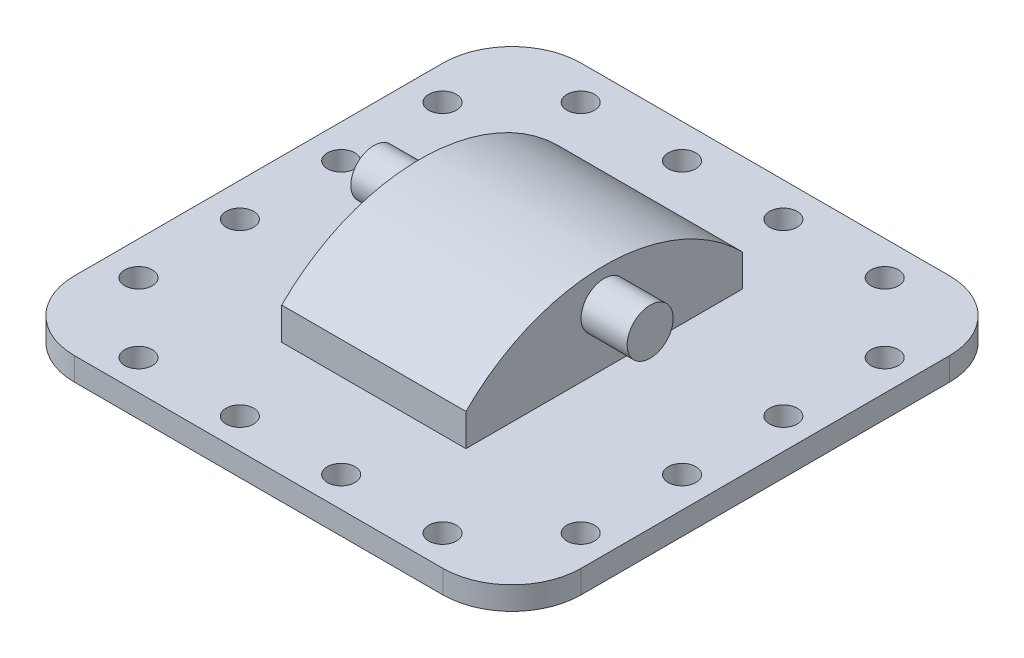
ISO-10303-21;
HEADER;
FILE_DESCRIPTION(('STEP AP214'),'2;1');
FILE_NAME('part.step','',(''),(''),'','','');
FILE_SCHEMA(('AUTOMOTIVE_DESIGN { 1 0 10303 214 1 1 1 1 }'));
ENDSEC;
DATA;
#1=APPLICATION_CONTEXT('core data for automotive mechanical design processes');
#2=APPLICATION_PROTOCOL_DEFINITION('international standard','automotive_design',2000,#1);
#3=PRODUCT_CONTEXT('',#1,'mechanical');
#4=PRODUCT('Part','Part','',(#3));
#5=PRODUCT_RELATED_PRODUCT_CATEGORY('part','',(#4));
#6=PRODUCT_DEFINITION_FORMATION('','',#4);
#7=PRODUCT_DEFINITION_CONTEXT('part definition',#1,'design');
#8=PRODUCT_DEFINITION('design','',#6,#7);
#9=PRODUCT_DEFINITION_SHAPE('','',#8);
#10=(LENGTH_UNIT() NAMED_UNIT(*) SI_UNIT(.MILLI.,.METRE.));
#11=(NAMED_UNIT(*) PLANE_ANGLE_UNIT() SI_UNIT($,.RADIAN.));
#12=(NAMED_UNIT(*) SI_UNIT($,.STERADIAN.) SOLID_ANGLE_UNIT());
#13=UNCERTAINTY_MEASURE_WITH_UNIT(LENGTH_MEASURE(1.E-05),#10,'distance_accuracy_value','');
#14=(GEOMETRIC_REPRESENTATION_CONTEXT(3) GLOBAL_UNCERTAINTY_ASSIGNED_CONTEXT((#13)) GLOBAL_UNIT_ASSIGNED_CONTEXT((#10,
#11,#12)) REPRESENTATION_CONTEXT('',''));
#15=CARTESIAN_POINT('',(0.,0.,0.));
#16=DIRECTION('',(0.,0.,1.));
#17=DIRECTION('',(1.,0.,0.));
#18=AXIS2_PLACEMENT_3D('',#15,#16,#17);
#19=CARTESIAN_POINT('',(40.,5.,55.));
#20=DIRECTION('',(0.,1.,0.));
#21=DIRECTION('',(0.,0.,1.));
#22=AXIS2_PLACEMENT_3D('',#19,#20,#21);
#23=PLANE('',#22);
#24=CARTESIAN_POINT('',(48.3346963055934,5.,-10.5816296180082));
#25=DIRECTION('',(0.,-1.,0.));
#26=DIRECTION('',(0.,0.,-1.));
#27=AXIS2_PLACEMENT_3D('',#24,#25,#26);
#28=CIRCLE('',#27,3.00000000000002);
#29=CARTESIAN_POINT('',(48.3346963055934,5.,-13.5816296180082));
#30=VERTEX_POINT('',#29);
#31=EDGE_CURVE('E151',#30,#30,#28,.T.);
#32=ORIENTED_EDGE('',*,*,#31,.T.);
#33=EDGE_LOOP('',(#32));
#34=FACE_BOUND('',#33,.T.);
#35=CARTESIAN_POINT('',(-32.6653036944065,5.,-47.5816296180083));
#36=DIRECTION('',(0.,-1.,0.));
#37=DIRECTION('',(0.,0.,-1.));
#38=AXIS2_PLACEMENT_3D('',#35,#36,#37);
#39=CIRCLE('',#38,3.00000000000001);
#40=CARTESIAN_POINT('',(-32.6653036944065,5.,-50.5816296180083));
#41=VERTEX_POINT('',#40);
#42=EDGE_CURVE('E155',#41,#41,#39,.T.);
#43=ORIENTED_EDGE('',*,*,#42,.T.);
#44=EDGE_LOOP('',(#43));
#45=FACE_BOUND('',#44,.T.);
#46=CARTESIAN_POINT('',(-47.6653036944066,5.,-32.5816296180082));
#47=DIRECTION('',(0.,-1.,0.));
#48=DIRECTION('',(0.,0.,-1.));
#49=AXIS2_PLACEMENT_3D('',#46,#47,#48);
#50=CIRCLE('',#49,3.);
#51=CARTESIAN_POINT('',(-47.6653036944066,5.,-35.5816296180082));
#52=VERTEX_POINT('',#51);
#53=EDGE_CURVE('E159',#52,#52,#50,.T.);
#54=ORIENTED_EDGE('',*,*,#53,.T.);
#55=EDGE_LOOP('',(#54));
#56=FACE_BOUND('',#55,.T.);
#57=CARTESIAN_POINT('',(-47.6653036944066,5.,-10.5816296180082));
#58=DIRECTION('',(0.,-1.,0.));
#59=DIRECTION('',(0.,0.,-1.));
#60=AXIS2_PLACEMENT_3D('',#57,#58,#59);
#61=CIRCLE('',#60,3.00000000000003);
#62=CARTESIAN_POINT('',(-47.6653036944066,5.,-13.5816296180083));
#63=VERTEX_POINT('',#62);
#64=EDGE_CURVE('E163',#63,#63,#61,.T.);
#65=ORIENTED_EDGE('',*,*,#64,.T.);
#66=EDGE_LOOP('',(#65));
#67=FACE_BOUND('',#66,.T.);
#68=CARTESIAN_POINT('',(-47.6653036944066,5.,11.4183703819918));
#69=DIRECTION('',(0.,-1.,0.));
#70=DIRECTION('',(0.,0.,-1.));
#71=AXIS2_PLACEMENT_3D('',#68,#69,#70);
#72=CIRCLE('',#71,2.99999999999997);
#73=CARTESIAN_POINT('',(-47.6653036944066,5.,8.4183703819918));
#74=VERTEX_POINT('',#73);
#75=EDGE_CURVE('E167',#74,#74,#72,.T.);
#76=ORIENTED_EDGE('',*,*,#75,.T.);
#77=EDGE_LOOP('',(#76));
#78=FACE_BOUND('',#77,.T.);
#79=CARTESIAN_POINT('',(-10.6653036944066,5.,48.4183703819918));
#80=DIRECTION('',(0.,-1.,0.));
#81=DIRECTION('',(0.,0.,-1.));
#82=AXIS2_PLACEMENT_3D('',#79,#80,#81);
#83=CIRCLE('',#82,3.00000000000002);
#84=CARTESIAN_POINT('',(-10.6653036944066,5.,45.4183703819917));
#85=VERTEX_POINT('',#84);
#86=EDGE_CURVE('E171',#85,#85,#83,.T.);
#87=ORIENTED_EDGE('',*,*,#86,.T.);
#88=EDGE_LOOP('',(#87));
#89=FACE_BOUND('',#88,.T.);
#90=CARTESIAN_POINT('',(11.3346963055934,5.,48.4183703819918));
#91=DIRECTION('',(0.,-1.,0.));
#92=DIRECTION('',(0.,0.,-1.));
#93=AXIS2_PLACEMENT_3D('',#90,#91,#92);
#94=CIRCLE('',#93,2.99999999999997);
#95=CARTESIAN_POINT('',(11.3346963055934,5.,45.4183703819918));
#96=VERTEX_POINT('',#95);
#97=EDGE_CURVE('E175',#96,#96,#94,.T.);
#98=ORIENTED_EDGE('',*,*,#97,.T.);
#99=EDGE_LOOP('',(#98));
#100=FACE_BOUND('',#99,.T.);
#101=CARTESIAN_POINT('',(33.3346963055934,5.,48.4183703819918));
#102=DIRECTION('',(0.,-1.,0.));
#103=DIRECTION('',(0.,0.,-1.));
#104=AXIS2_PLACEMENT_3D('',#101,#102,#103);
#105=CIRCLE('',#104,3.00000000000001);
#106=CARTESIAN_POINT('',(33.3346963055934,5.,45.4183703819917));
#107=VERTEX_POINT('',#106);
#108=EDGE_CURVE('E179',#107,#107,#105,.T.);
#109=ORIENTED_EDGE('',*,*,#108,.T.);
#110=EDGE_LOOP('',(#109));
#111=FACE_BOUND('',#110,.T.);
#112=CARTESIAN_POINT('',(48.3346963055934,5.,11.4183703819918));
#113=DIRECTION('',(0.,-1.,0.));
#114=DIRECTION('',(0.,0.,-1.));
#115=AXIS2_PLACEMENT_3D('',#112,#113,#114);
#116=CIRCLE('',#115,2.99999999999997);
#117=CARTESIAN_POINT('',(48.3346963055934,5.,8.4183703819918));
#118=VERTEX_POINT('',#117);
#119=EDGE_CURVE('E183',#118,#118,#116,.T.);
#120=ORIENTED_EDGE('',*,*,#119,.T.);
#121=EDGE_LOOP('',(#120));
#122=FACE_BOUND('',#121,.T.);
#123=CARTESIAN_POINT('',(48.3346963055935,5.,-32.5816296180082));
#124=DIRECTION('',(0.,-1.,0.));
#125=DIRECTION('',(0.,0.,-1.));
#126=AXIS2_PLACEMENT_3D('',#123,#124,#125);
#127=CIRCLE('',#126,3.00000000000001);
#128=CARTESIAN_POINT('',(48.3346963055935,5.,-35.5816296180082));
#129=VERTEX_POINT('',#128);
#130=EDGE_CURVE('E187',#129,#129,#127,.T.);
#131=ORIENTED_EDGE('',*,*,#130,.T.);
#132=EDGE_LOOP('',(#131));
#133=FACE_BOUND('',#132,.T.);
#134=CARTESIAN_POINT('',(33.3346963055935,5.,-47.5816296180082));
#135=DIRECTION('',(0.,-1.,0.));
#136=DIRECTION('',(0.,0.,-1.));
#137=AXIS2_PLACEMENT_3D('',#134,#135,#136);
#138=CIRCLE('',#137,2.99999999999997);
#139=CARTESIAN_POINT('',(33.3346963055935,5.,-50.5816296180082));
#140=VERTEX_POINT('',#139);
#141=EDGE_CURVE('E191',#140,#140,#138,.T.);
#142=ORIENTED_EDGE('',*,*,#141,.T.);
#143=EDGE_LOOP('',(#142));
#144=FACE_BOUND('',#143,.T.);
#145=CARTESIAN_POINT('',(11.3346963055935,5.,-47.5816296180082));
#146=DIRECTION('',(0.,-1.,0.));
#147=DIRECTION('',(0.,0.,-1.));
#148=AXIS2_PLACEMENT_3D('',#145,#146,#147);
#149=CIRCLE('',#148,2.99999999999997);
#150=CARTESIAN_POINT('',(11.3346963055935,5.,-50.5816296180082));
#151=VERTEX_POINT('',#150);
#152=EDGE_CURVE('E195',#151,#151,#149,.T.);
#153=ORIENTED_EDGE('',*,*,#152,.T.);
#154=EDGE_LOOP('',(#153));
#155=FACE_BOUND('',#154,.T.);
#156=CARTESIAN_POINT('',(-10.6653036944065,5.,-47.5816296180082));
#157=DIRECTION('',(0.,-1.,0.));
#158=DIRECTION('',(0.,0.,-1.));
#159=AXIS2_PLACEMENT_3D('',#156,#157,#158);
#160=CIRCLE('',#159,3.00000000000002);
#161=CARTESIAN_POINT('',(-10.6653036944065,5.,-50.5816296180083));
#162=VERTEX_POINT('',#161);
#163=EDGE_CURVE('E199',#162,#162,#160,.T.);
#164=ORIENTED_EDGE('',*,*,#163,.T.);
#165=EDGE_LOOP('',(#164));
#166=FACE_BOUND('',#165,.T.);
#167=CARTESIAN_POINT('',(-47.6653036944065,5.,33.4183703819918));
#168=DIRECTION('',(0.,-1.,0.));
#169=DIRECTION('',(0.,0.,-1.));
#170=AXIS2_PLACEMENT_3D('',#167,#168,#169);
#171=CIRCLE('',#170,3.);
#172=CARTESIAN_POINT('',(-47.6653036944065,5.,30.4183703819918));
#173=VERTEX_POINT('',#172);
#174=EDGE_CURVE('E203',#173,#173,#171,.T.);
#175=ORIENTED_EDGE('',*,*,#174,.T.);
#176=EDGE_LOOP('',(#175));
#177=FACE_BOUND('',#176,.T.);
#178=CARTESIAN_POINT('',(-32.6653036944065,5.,48.4183703819918));
#179=DIRECTION('',(0.,-1.,0.));
#180=DIRECTION('',(0.,0.,-1.));
#181=AXIS2_PLACEMENT_3D('',#178,#179,#180);
#182=CIRCLE('',#181,3.00000000000001);
#183=CARTESIAN_POINT('',(-32.6653036944065,5.,45.4183703819918));
#184=VERTEX_POINT('',#183);
#185=EDGE_CURVE('E207',#184,#184,#182,.T.);
#186=ORIENTED_EDGE('',*,*,#185,.T.);
#187=EDGE_LOOP('',(#186));
#188=FACE_BOUND('',#187,.T.);
#189=CARTESIAN_POINT('',(48.3346963055934,5.,33.4183703819918));
#190=DIRECTION('',(0.,-1.,0.));
#191=DIRECTION('',(0.,0.,-1.));
#192=AXIS2_PLACEMENT_3D('',#189,#190,#191);
#193=CIRCLE('',#192,3.00000000000001);
#194=CARTESIAN_POINT('',(48.3346963055934,5.,30.4183703819918));
#195=VERTEX_POINT('',#194);
#196=EDGE_CURVE('E211',#195,#195,#193,.T.);
#197=ORIENTED_EDGE('',*,*,#196,.T.);
#198=EDGE_LOOP('',(#197));
#199=FACE_BOUND('',#198,.T.);
#200=DIRECTION('',(1.,0.,0.));
#201=VECTOR('',#200,1.);
#202=CARTESIAN_POINT('',(-55.,5.,55.));
#203=LINE('',#202,#201);
#204=CARTESIAN_POINT('',(-40.,5.,55.));
#205=VERTEX_POINT('',#204);
#206=CARTESIAN_POINT('',(40.,5.,55.));
#207=VERTEX_POINT('',#206);
#208=EDGE_CURVE('E122',#205,#207,#203,.T.);
#209=ORIENTED_EDGE('',*,*,#208,.T.);
#210=CARTESIAN_POINT('',(40.,5.,40.));
#211=DIRECTION('',(0.,-1.,0.));
#212=DIRECTION('',(0.,0.,-1.));
#213=AXIS2_PLACEMENT_3D('',#210,#211,#212);
#214=CIRCLE('',#213,15.);
#215=CARTESIAN_POINT('',(55.,5.,40.));
#216=VERTEX_POINT('',#215);
#217=EDGE_CURVE('E119',#207,#216,#214,.F.);
#218=ORIENTED_EDGE('',*,*,#217,.T.);
#219=DIRECTION('',(0.,0.,-1.));
#220=VECTOR('',#219,1.);
#221=CARTESIAN_POINT('',(55.,5.,55.));
#222=LINE('',#221,#220);
#223=CARTESIAN_POINT('',(55.,5.,-40.));
#224=VERTEX_POINT('',#223);
#225=EDGE_CURVE('E77',#216,#224,#222,.T.);
#226=ORIENTED_EDGE('',*,*,#225,.T.);
#227=CARTESIAN_POINT('',(40.,5.,-40.));
#228=DIRECTION('',(0.,-1.,0.));
#229=DIRECTION('',(0.,0.,-1.));
#230=AXIS2_PLACEMENT_3D('',#227,#228,#229);
#231=CIRCLE('',#230,15.);
#232=CARTESIAN_POINT('',(40.,5.,-55.));
#233=VERTEX_POINT('',#232);
#234=EDGE_CURVE('E345',#224,#233,#231,.F.);
#235=ORIENTED_EDGE('',*,*,#234,.T.);
#236=DIRECTION('',(-1.,0.,0.));
#237=VECTOR('',#236,1.);
#238=CARTESIAN_POINT('',(-55.,5.,-55.));
#239=LINE('',#238,#237);
#240=CARTESIAN_POINT('',(-40.,5.,-55.));
#241=VERTEX_POINT('',#240);
#242=EDGE_CURVE('E139',#233,#241,#239,.T.);
#243=ORIENTED_EDGE('',*,*,#242,.T.);
#244=CARTESIAN_POINT('',(-40.,5.,-40.));
#245=DIRECTION('',(0.,-1.,0.));
#246=DIRECTION('',(0.,0.,-1.));
#247=AXIS2_PLACEMENT_3D('',#244,#245,#246);
#248=CIRCLE('',#247,15.);
#249=CARTESIAN_POINT('',(-55.,5.,-40.));
#250=VERTEX_POINT('',#249);
#251=EDGE_CURVE('E313',#241,#250,#248,.F.);
#252=ORIENTED_EDGE('',*,*,#251,.T.);
#253=DIRECTION('',(0.,0.,1.));
#254=VECTOR('',#253,1.);
#255=CARTESIAN_POINT('',(-55.,5.,55.));
#256=LINE('',#255,#254);
#257=CARTESIAN_POINT('',(-55.,5.,40.));
#258=VERTEX_POINT('',#257);
#259=EDGE_CURVE('E147',#250,#258,#256,.T.);
#260=ORIENTED_EDGE('',*,*,#259,.T.);
#261=CARTESIAN_POINT('',(-40.,5.,40.));
#262=DIRECTION('',(0.,-1.,0.));
#263=DIRECTION('',(0.,0.,-1.));
#264=AXIS2_PLACEMENT_3D('',#261,#262,#263);
#265=CIRCLE('',#264,15.);
#266=EDGE_CURVE('E311',#258,#205,#265,.F.);
#267=ORIENTED_EDGE('',*,*,#266,.T.);
#268=EDGE_LOOP('',(#209,#218,#226,#235,#243,#252,#260,#267));
#269=FACE_BOUND('',#268,.T.);
#270=ADVANCED_FACE('F52',(#34,#45,#56,#67,#78,#89,#100,#111,#122,#133,#144,#155,#166,#177,#188,
#199,#269),#23,.T.);
#271=CARTESIAN_POINT('',(40.,5.,-40.));
#272=DIRECTION('',(0.,1.,0.));
#273=DIRECTION('',(0.,0.,1.));
#274=AXIS2_PLACEMENT_3D('',#271,#272,#273);
#275=CYLINDRICAL_SURFACE('',#274,15.);
#276=DIRECTION('',(0.,1.,0.));
#277=VECTOR('',#276,1.);
#278=CARTESIAN_POINT('',(55.,5.,-40.));
#279=LINE('',#278,#277);
#280=CARTESIAN_POINT('',(55.,0.,-40.));
#281=VERTEX_POINT('',#280);
#282=EDGE_CURVE('E136',#281,#224,#279,.T.);
#283=ORIENTED_EDGE('',*,*,#282,.F.);
#284=CARTESIAN_POINT('',(40.,0.,-40.));
#285=DIRECTION('',(0.,-1.,0.));
#286=DIRECTION('',(0.,0.,-1.));
#287=AXIS2_PLACEMENT_3D('',#284,#285,#286);
#288=CIRCLE('',#287,15.);
#289=CARTESIAN_POINT('',(40.,0.,-55.));
#290=VERTEX_POINT('',#289);
#291=EDGE_CURVE('E298',#290,#281,#288,.T.);
#292=ORIENTED_EDGE('',*,*,#291,.F.);
#293=DIRECTION('',(0.,1.,0.));
#294=VECTOR('',#293,1.);
#295=CARTESIAN_POINT('',(40.,5.,-55.));
#296=LINE('',#295,#294);
#297=EDGE_CURVE('E350',#233,#290,#296,.F.);
#298=ORIENTED_EDGE('',*,*,#297,.F.);
#299=ORIENTED_EDGE('',*,*,#234,.F.);
#300=EDGE_LOOP('',(#283,#292,#298,#299));
#301=FACE_BOUND('',#300,.T.);
#302=ADVANCED_FACE('F364',(#301),#275,.T.);
#303=CARTESIAN_POINT('',(-40.,5.,-40.));
#304=DIRECTION('',(0.,1.,0.));
#305=DIRECTION('',(0.,0.,1.));
#306=AXIS2_PLACEMENT_3D('',#303,#304,#305);
#307=CYLINDRICAL_SURFACE('',#306,15.);
#308=DIRECTION('',(0.,1.,0.));
#309=VECTOR('',#308,1.);
#310=CARTESIAN_POINT('',(-40.,5.,-55.));
#311=LINE('',#310,#309);
#312=CARTESIAN_POINT('',(-40.,0.,-55.));
#313=VERTEX_POINT('',#312);
#314=EDGE_CURVE('E341',#313,#241,#311,.T.);
#315=ORIENTED_EDGE('',*,*,#314,.F.);
#316=CARTESIAN_POINT('',(-40.,0.,-40.));
#317=DIRECTION('',(0.,-1.,0.));
#318=DIRECTION('',(0.,0.,-1.));
#319=AXIS2_PLACEMENT_3D('',#316,#317,#318);
#320=CIRCLE('',#319,15.);
#321=CARTESIAN_POINT('',(-55.,0.,-40.));
#322=VERTEX_POINT('',#321);
#323=EDGE_CURVE('E330',#322,#313,#320,.T.);
#324=ORIENTED_EDGE('',*,*,#323,.F.);
#325=DIRECTION('',(0.,1.,0.));
#326=VECTOR('',#325,1.);
#327=CARTESIAN_POINT('',(-55.,5.,-40.));
#328=LINE('',#327,#326);
#329=EDGE_CURVE('E320',#250,#322,#328,.F.);
#330=ORIENTED_EDGE('',*,*,#329,.F.);
#331=ORIENTED_EDGE('',*,*,#251,.F.);
#332=EDGE_LOOP('',(#315,#324,#330,#331));
#333=FACE_BOUND('',#332,.T.);
#334=ADVANCED_FACE('F363',(#333),#307,.T.);
#335=CARTESIAN_POINT('',(-40.,5.,40.));
#336=DIRECTION('',(0.,1.,0.));
#337=DIRECTION('',(0.,0.,1.));
#338=AXIS2_PLACEMENT_3D('',#335,#336,#337);
#339=CYLINDRICAL_SURFACE('',#338,15.);
#340=DIRECTION('',(0.,1.,0.));
#341=VECTOR('',#340,1.);
#342=CARTESIAN_POINT('',(-55.,5.,40.));
#343=LINE('',#342,#341);
#344=CARTESIAN_POINT('',(-55.,0.,40.));
#345=VERTEX_POINT('',#344);
#346=EDGE_CURVE('E323',#345,#258,#343,.T.);
#347=ORIENTED_EDGE('',*,*,#346,.F.);
#348=CARTESIAN_POINT('',(-40.,0.,40.));
#349=DIRECTION('',(0.,-1.,0.));
#350=DIRECTION('',(0.,0.,-1.));
#351=AXIS2_PLACEMENT_3D('',#348,#349,#350);
#352=CIRCLE('',#351,15.);
#353=CARTESIAN_POINT('',(-40.,0.,55.));
#354=VERTEX_POINT('',#353);
#355=EDGE_CURVE('E333',#354,#345,#352,.T.);
#356=ORIENTED_EDGE('',*,*,#355,.F.);
#357=DIRECTION('',(0.,1.,0.));
#358=VECTOR('',#357,1.);
#359=CARTESIAN_POINT('',(-40.,5.,55.));
#360=LINE('',#359,#358);
#361=EDGE_CURVE('E326',#205,#354,#360,.F.);
#362=ORIENTED_EDGE('',*,*,#361,.F.);
#363=ORIENTED_EDGE('',*,*,#266,.F.);
#364=EDGE_LOOP('',(#347,#356,#362,#363));
#365=FACE_BOUND('',#364,.T.);
#366=ADVANCED_FACE('F371',(#365),#339,.T.);
#367=CARTESIAN_POINT('',(40.,5.,40.));
#368=DIRECTION('',(0.,1.,0.));
#369=DIRECTION('',(0.,0.,1.));
#370=AXIS2_PLACEMENT_3D('',#367,#368,#369);
#371=CYLINDRICAL_SURFACE('',#370,15.);
#372=DIRECTION('',(0.,1.,0.));
#373=VECTOR('',#372,1.);
#374=CARTESIAN_POINT('',(40.,5.,55.));
#375=LINE('',#374,#373);
#376=CARTESIAN_POINT('',(40.,0.,55.));
#377=VERTEX_POINT('',#376);
#378=EDGE_CURVE('E132',#377,#207,#375,.T.);
#379=ORIENTED_EDGE('',*,*,#378,.F.);
#380=CARTESIAN_POINT('',(40.,0.,40.));
#381=DIRECTION('',(0.,-1.,0.));
#382=DIRECTION('',(0.,0.,-1.));
#383=AXIS2_PLACEMENT_3D('',#380,#381,#382);
#384=CIRCLE('',#383,15.);
#385=CARTESIAN_POINT('',(55.,0.,40.));
#386=VERTEX_POINT('',#385);
#387=EDGE_CURVE('E127',#386,#377,#384,.T.);
#388=ORIENTED_EDGE('',*,*,#387,.F.);
#389=DIRECTION('',(0.,1.,0.));
#390=VECTOR('',#389,1.);
#391=CARTESIAN_POINT('',(55.,5.,40.));
#392=LINE('',#391,#390);
#393=EDGE_CURVE('E129',#216,#386,#392,.F.);
#394=ORIENTED_EDGE('',*,*,#393,.F.);
#395=ORIENTED_EDGE('',*,*,#217,.F.);
#396=EDGE_LOOP('',(#379,#388,#394,#395));
#397=FACE_BOUND('',#396,.T.);
#398=ADVANCED_FACE('F130',(#397),#371,.T.);
#399=CARTESIAN_POINT('',(0.,0.,0.));
#400=DIRECTION('',(0.,-1.,0.));
#401=DIRECTION('',(0.,0.,-1.));
#402=AXIS2_PLACEMENT_3D('',#399,#400,#401);
#403=PLANE('',#402);
#404=CARTESIAN_POINT('',(48.3346963055934,0.,-10.5816296180082));
#405=DIRECTION('',(0.,-1.,0.));
#406=DIRECTION('',(0.,0.,-1.));
#407=AXIS2_PLACEMENT_3D('',#404,#405,#406);
#408=CIRCLE('',#407,3.00000000000002);
#409=CARTESIAN_POINT('',(48.3346963055934,0.,-13.5816296180082));
#410=VERTEX_POINT('',#409);
#411=EDGE_CURVE('E219',#410,#410,#408,.T.);
#412=ORIENTED_EDGE('',*,*,#411,.F.);
#413=EDGE_LOOP('',(#412));
#414=FACE_BOUND('',#413,.T.);
#415=CARTESIAN_POINT('',(-32.6653036944065,0.,-47.5816296180083));
#416=DIRECTION('',(0.,-1.,0.));
#417=DIRECTION('',(0.,0.,-1.));
#418=AXIS2_PLACEMENT_3D('',#415,#416,#417);
#419=CIRCLE('',#418,3.00000000000001);
#420=CARTESIAN_POINT('',(-32.6653036944065,0.,-50.5816296180083));
#421=VERTEX_POINT('',#420);
#422=EDGE_CURVE('E244',#421,#421,#419,.T.);
#423=ORIENTED_EDGE('',*,*,#422,.F.);
#424=EDGE_LOOP('',(#423));
#425=FACE_BOUND('',#424,.T.);
#426=CARTESIAN_POINT('',(-47.6653036944066,0.,-32.5816296180082));
#427=DIRECTION('',(0.,-1.,0.));
#428=DIRECTION('',(0.,0.,-1.));
#429=AXIS2_PLACEMENT_3D('',#426,#427,#428);
#430=CIRCLE('',#429,3.);
#431=CARTESIAN_POINT('',(-47.6653036944066,0.,-35.5816296180082));
#432=VERTEX_POINT('',#431);
#433=EDGE_CURVE('E240',#432,#432,#430,.T.);
#434=ORIENTED_EDGE('',*,*,#433,.F.);
#435=EDGE_LOOP('',(#434));
#436=FACE_BOUND('',#435,.T.);
#437=CARTESIAN_POINT('',(-47.6653036944066,0.,-10.5816296180082));
#438=DIRECTION('',(0.,-1.,0.));
#439=DIRECTION('',(0.,0.,-1.));
#440=AXIS2_PLACEMENT_3D('',#437,#438,#439);
#441=CIRCLE('',#440,3.00000000000003);
#442=CARTESIAN_POINT('',(-47.6653036944066,0.,-13.5816296180083));
#443=VERTEX_POINT('',#442);
#444=EDGE_CURVE('E236',#443,#443,#441,.T.);
#445=ORIENTED_EDGE('',*,*,#444,.F.);
#446=EDGE_LOOP('',(#445));
#447=FACE_BOUND('',#446,.T.);
#448=CARTESIAN_POINT('',(-47.6653036944066,0.,11.4183703819918));
#449=DIRECTION('',(0.,-1.,0.));
#450=DIRECTION('',(0.,0.,-1.));
#451=AXIS2_PLACEMENT_3D('',#448,#449,#450);
#452=CIRCLE('',#451,2.99999999999997);
#453=CARTESIAN_POINT('',(-47.6653036944066,0.,8.4183703819918));
#454=VERTEX_POINT('',#453);
#455=EDGE_CURVE('E232',#454,#454,#452,.T.);
#456=ORIENTED_EDGE('',*,*,#455,.F.);
#457=EDGE_LOOP('',(#456));
#458=FACE_BOUND('',#457,.T.);
#459=CARTESIAN_POINT('',(-10.6653036944066,0.,48.4183703819918));
#460=DIRECTION('',(0.,-1.,0.));
#461=DIRECTION('',(0.,0.,-1.));
#462=AXIS2_PLACEMENT_3D('',#459,#460,#461);
#463=CIRCLE('',#462,3.00000000000002);
#464=CARTESIAN_POINT('',(-10.6653036944066,0.,45.4183703819917));
#465=VERTEX_POINT('',#464);
#466=EDGE_CURVE('E228',#465,#465,#463,.T.);
#467=ORIENTED_EDGE('',*,*,#466,.F.);
#468=EDGE_LOOP('',(#467));
#469=FACE_BOUND('',#468,.T.);
#470=CARTESIAN_POINT('',(11.3346963055934,0.,48.4183703819918));
#471=DIRECTION('',(0.,-1.,0.));
#472=DIRECTION('',(0.,0.,-1.));
#473=AXIS2_PLACEMENT_3D('',#470,#471,#472);
#474=CIRCLE('',#473,2.99999999999997);
#475=CARTESIAN_POINT('',(11.3346963055934,0.,45.4183703819918));
#476=VERTEX_POINT('',#475);
#477=EDGE_CURVE('E224',#476,#476,#474,.T.);
#478=ORIENTED_EDGE('',*,*,#477,.F.);
#479=EDGE_LOOP('',(#478));
#480=FACE_BOUND('',#479,.T.);
#481=CARTESIAN_POINT('',(33.3346963055934,0.,48.4183703819918));
#482=DIRECTION('',(0.,-1.,0.));
#483=DIRECTION('',(0.,0.,-1.));
#484=AXIS2_PLACEMENT_3D('',#481,#482,#483);
#485=CIRCLE('',#484,3.00000000000001);
#486=CARTESIAN_POINT('',(33.3346963055934,0.,45.4183703819917));
#487=VERTEX_POINT('',#486);
#488=EDGE_CURVE('E220',#487,#487,#485,.T.);
#489=ORIENTED_EDGE('',*,*,#488,.F.);
#490=EDGE_LOOP('',(#489));
#491=FACE_BOUND('',#490,.T.);
#492=CARTESIAN_POINT('',(48.3346963055934,0.,11.4183703819918));
#493=DIRECTION('',(0.,-1.,0.));
#494=DIRECTION('',(0.,0.,-1.));
#495=AXIS2_PLACEMENT_3D('',#492,#493,#494);
#496=CIRCLE('',#495,2.99999999999997);
#497=CARTESIAN_POINT('',(48.3346963055934,0.,8.4183703819918));
#498=VERTEX_POINT('',#497);
#499=EDGE_CURVE('E55',#498,#498,#496,.T.);
#500=ORIENTED_EDGE('',*,*,#499,.F.);
#501=EDGE_LOOP('',(#500));
#502=FACE_BOUND('',#501,.T.);
#503=CARTESIAN_POINT('',(48.3346963055935,0.,-32.5816296180082));
#504=DIRECTION('',(0.,-1.,0.));
#505=DIRECTION('',(0.,0.,-1.));
#506=AXIS2_PLACEMENT_3D('',#503,#504,#505);
#507=CIRCLE('',#506,3.00000000000001);
#508=CARTESIAN_POINT('',(48.3346963055935,0.,-35.5816296180082));
#509=VERTEX_POINT('',#508);
#510=EDGE_CURVE('E265',#509,#509,#507,.T.);
#511=ORIENTED_EDGE('',*,*,#510,.F.);
#512=EDGE_LOOP('',(#511));
#513=FACE_BOUND('',#512,.T.);
#514=CARTESIAN_POINT('',(33.3346963055935,0.,-47.5816296180082));
#515=DIRECTION('',(0.,-1.,0.));
#516=DIRECTION('',(0.,0.,-1.));
#517=AXIS2_PLACEMENT_3D('',#514,#515,#516);
#518=CIRCLE('',#517,2.99999999999997);
#519=CARTESIAN_POINT('',(33.3346963055935,0.,-50.5816296180082));
#520=VERTEX_POINT('',#519);
#521=EDGE_CURVE('E262',#520,#520,#518,.T.);
#522=ORIENTED_EDGE('',*,*,#521,.F.);
#523=EDGE_LOOP('',(#522));
#524=FACE_BOUND('',#523,.T.);
#525=CARTESIAN_POINT('',(11.3346963055935,0.,-47.5816296180082));
#526=DIRECTION('',(0.,-1.,0.));
#527=DIRECTION('',(0.,0.,-1.));
#528=AXIS2_PLACEMENT_3D('',#525,#526,#527);
#529=CIRCLE('',#528,2.99999999999997);
#530=CARTESIAN_POINT('',(11.3346963055935,0.,-50.5816296180082));
#531=VERTEX_POINT('',#530);
#532=EDGE_CURVE('E258',#531,#531,#529,.T.);
#533=ORIENTED_EDGE('',*,*,#532,.F.);
#534=EDGE_LOOP('',(#533));
#535=FACE_BOUND('',#534,.T.);
#536=CARTESIAN_POINT('',(-10.6653036944065,0.,-47.5816296180082));
#537=DIRECTION('',(0.,-1.,0.));
#538=DIRECTION('',(0.,0.,-1.));
#539=AXIS2_PLACEMENT_3D('',#536,#537,#538);
#540=CIRCLE('',#539,3.00000000000002);
#541=CARTESIAN_POINT('',(-10.6653036944065,0.,-50.5816296180083));
#542=VERTEX_POINT('',#541);
#543=EDGE_CURVE('E254',#542,#542,#540,.T.);
#544=ORIENTED_EDGE('',*,*,#543,.F.);
#545=EDGE_LOOP('',(#544));
#546=FACE_BOUND('',#545,.T.);
#547=CARTESIAN_POINT('',(-47.6653036944065,0.,33.4183703819918));
#548=DIRECTION('',(0.,-1.,0.));
#549=DIRECTION('',(0.,0.,-1.));
#550=AXIS2_PLACEMENT_3D('',#547,#548,#549);
#551=CIRCLE('',#550,3.);
#552=CARTESIAN_POINT('',(-47.6653036944065,0.,30.4183703819918));
#553=VERTEX_POINT('',#552);
#554=EDGE_CURVE('E61',#553,#553,#551,.T.);
#555=ORIENTED_EDGE('',*,*,#554,.F.);
#556=EDGE_LOOP('',(#555));
#557=FACE_BOUND('',#556,.T.);
#558=CARTESIAN_POINT('',(-32.6653036944065,0.,48.4183703819918));
#559=DIRECTION('',(0.,-1.,0.));
#560=DIRECTION('',(0.,0.,-1.));
#561=AXIS2_PLACEMENT_3D('',#558,#559,#560);
#562=CIRCLE('',#561,3.00000000000001);
#563=CARTESIAN_POINT('',(-32.6653036944065,0.,45.4183703819918));
#564=VERTEX_POINT('',#563);
#565=EDGE_CURVE('E12',#564,#564,#562,.T.);
#566=ORIENTED_EDGE('',*,*,#565,.F.);
#567=EDGE_LOOP('',(#566));
#568=FACE_BOUND('',#567,.T.);
#569=CARTESIAN_POINT('',(48.3346963055934,0.,33.4183703819918));
#570=DIRECTION('',(0.,-1.,0.));
#571=DIRECTION('',(0.,0.,-1.));
#572=AXIS2_PLACEMENT_3D('',#569,#570,#571);
#573=CIRCLE('',#572,3.00000000000001);
#574=CARTESIAN_POINT('',(48.3346963055934,0.,30.4183703819918));
#575=VERTEX_POINT('',#574);
#576=EDGE_CURVE('E215',#575,#575,#573,.T.);
#577=ORIENTED_EDGE('',*,*,#576,.F.);
#578=EDGE_LOOP('',(#577));
#579=FACE_BOUND('',#578,.T.);
#580=DIRECTION('',(0.,0.,-1.));
#581=VECTOR('',#580,1.);
#582=CARTESIAN_POINT('',(55.,0.,55.));
#583=LINE('',#582,#581);
#584=EDGE_CURVE('E69',#386,#281,#583,.T.);
#585=ORIENTED_EDGE('',*,*,#584,.F.);
#586=ORIENTED_EDGE('',*,*,#387,.T.);
#587=DIRECTION('',(1.,0.,0.));
#588=VECTOR('',#587,1.);
#589=CARTESIAN_POINT('',(-55.,0.,55.));
#590=LINE('',#589,#588);
#591=EDGE_CURVE('E138',#354,#377,#590,.T.);
#592=ORIENTED_EDGE('',*,*,#591,.F.);
#593=ORIENTED_EDGE('',*,*,#355,.T.);
#594=DIRECTION('',(0.,0.,1.));
#595=VECTOR('',#594,1.);
#596=CARTESIAN_POINT('',(-55.,0.,55.));
#597=LINE('',#596,#595);
#598=EDGE_CURVE('E144',#322,#345,#597,.T.);
#599=ORIENTED_EDGE('',*,*,#598,.F.);
#600=ORIENTED_EDGE('',*,*,#323,.T.);
#601=DIRECTION('',(-1.,0.,0.));
#602=VECTOR('',#601,1.);
#603=CARTESIAN_POINT('',(-55.,0.,-55.));
#604=LINE('',#603,#602);
#605=EDGE_CURVE('E300',#290,#313,#604,.T.);
#606=ORIENTED_EDGE('',*,*,#605,.F.);
#607=ORIENTED_EDGE('',*,*,#291,.T.);
#608=EDGE_LOOP('',(#585,#586,#592,#593,#599,#600,#606,#607));
#609=FACE_BOUND('',#608,.T.);
#610=ADVANCED_FACE('F277',(#414,#425,#436,#447,#458,#469,#480,#491,#502,#513,#524,#535,#546,
#557,#568,#579,#609),#403,.T.);
#611=CARTESIAN_POINT('',(48.3346963055934,10.,-10.5816296180082));
#612=DIRECTION('',(0.,-1.,0.));
#613=DIRECTION('',(0.,0.,-1.));
#614=AXIS2_PLACEMENT_3D('',#611,#612,#613);
#615=CYLINDRICAL_SURFACE('',#614,3.00000000000002);
#616=ORIENTED_EDGE('',*,*,#411,.T.);
#617=EDGE_LOOP('',(#616));
#618=FACE_BOUND('',#617,.T.);
#619=ORIENTED_EDGE('',*,*,#31,.F.);
#620=EDGE_LOOP('',(#619));
#621=FACE_BOUND('',#620,.T.);
#622=ADVANCED_FACE('F280',(#618,#621),#615,.F.);
#623=CARTESIAN_POINT('',(-32.6653036944065,10.,-47.5816296180083));
#624=DIRECTION('',(0.,-1.,0.));
#625=DIRECTION('',(0.,0.,-1.));
#626=AXIS2_PLACEMENT_3D('',#623,#624,#625);
#627=CYLINDRICAL_SURFACE('',#626,3.00000000000001);
#628=ORIENTED_EDGE('',*,*,#422,.T.);
#629=EDGE_LOOP('',(#628));
#630=FACE_BOUND('',#629,.T.);
#631=ORIENTED_EDGE('',*,*,#42,.F.);
#632=EDGE_LOOP('',(#631));
#633=FACE_BOUND('',#632,.T.);
#634=ADVANCED_FACE('F414',(#630,#633),#627,.F.);
#635=CARTESIAN_POINT('',(-47.6653036944066,10.,-32.5816296180082));
#636=DIRECTION('',(0.,-1.,0.));
#637=DIRECTION('',(0.,0.,-1.));
#638=AXIS2_PLACEMENT_3D('',#635,#636,#637);
#639=CYLINDRICAL_SURFACE('',#638,3.);
#640=ORIENTED_EDGE('',*,*,#433,.T.);
#641=EDGE_LOOP('',(#640));
#642=FACE_BOUND('',#641,.T.);
#643=ORIENTED_EDGE('',*,*,#53,.F.);
#644=EDGE_LOOP('',(#643));
#645=FACE_BOUND('',#644,.T.);
#646=ADVANCED_FACE('F410',(#642,#645),#639,.F.);
#647=CARTESIAN_POINT('',(-47.6653036944066,10.,-10.5816296180082));
#648=DIRECTION('',(0.,-1.,0.));
#649=DIRECTION('',(0.,0.,-1.));
#650=AXIS2_PLACEMENT_3D('',#647,#648,#649);
#651=CYLINDRICAL_SURFACE('',#650,3.00000000000003);
#652=ORIENTED_EDGE('',*,*,#444,.T.);
#653=EDGE_LOOP('',(#652));
#654=FACE_BOUND('',#653,.T.);
#655=ORIENTED_EDGE('',*,*,#64,.F.);
#656=EDGE_LOOP('',(#655));
#657=FACE_BOUND('',#656,.T.);
#658=ADVANCED_FACE('F406',(#654,#657),#651,.F.);
#659=CARTESIAN_POINT('',(-47.6653036944066,10.,11.4183703819918));
#660=DIRECTION('',(0.,-1.,0.));
#661=DIRECTION('',(0.,0.,-1.));
#662=AXIS2_PLACEMENT_3D('',#659,#660,#661);
#663=CYLINDRICAL_SURFACE('',#662,2.99999999999997);
#664=ORIENTED_EDGE('',*,*,#455,.T.);
#665=EDGE_LOOP('',(#664));
#666=FACE_BOUND('',#665,.T.);
#667=ORIENTED_EDGE('',*,*,#75,.F.);
#668=EDGE_LOOP('',(#667));
#669=FACE_BOUND('',#668,.T.);
#670=ADVANCED_FACE('F402',(#666,#669),#663,.F.);
#671=CARTESIAN_POINT('',(-10.6653036944066,10.,48.4183703819918));
#672=DIRECTION('',(0.,-1.,0.));
#673=DIRECTION('',(0.,0.,-1.));
#674=AXIS2_PLACEMENT_3D('',#671,#672,#673);
#675=CYLINDRICAL_SURFACE('',#674,3.00000000000002);
#676=ORIENTED_EDGE('',*,*,#466,.T.);
#677=EDGE_LOOP('',(#676));
#678=FACE_BOUND('',#677,.T.);
#679=ORIENTED_EDGE('',*,*,#86,.F.);
#680=EDGE_LOOP('',(#679));
#681=FACE_BOUND('',#680,.T.);
#682=ADVANCED_FACE('F398',(#678,#681),#675,.F.);
#683=CARTESIAN_POINT('',(11.3346963055934,10.,48.4183703819918));
#684=DIRECTION('',(0.,-1.,0.));
#685=DIRECTION('',(0.,0.,-1.));
#686=AXIS2_PLACEMENT_3D('',#683,#684,#685);
#687=CYLINDRICAL_SURFACE('',#686,2.99999999999997);
#688=ORIENTED_EDGE('',*,*,#477,.T.);
#689=EDGE_LOOP('',(#688));
#690=FACE_BOUND('',#689,.T.);
#691=ORIENTED_EDGE('',*,*,#97,.F.);
#692=EDGE_LOOP('',(#691));
#693=FACE_BOUND('',#692,.T.);
#694=ADVANCED_FACE('F394',(#690,#693),#687,.F.);
#695=CARTESIAN_POINT('',(33.3346963055934,10.,48.4183703819918));
#696=DIRECTION('',(0.,-1.,0.));
#697=DIRECTION('',(0.,0.,-1.));
#698=AXIS2_PLACEMENT_3D('',#695,#696,#697);
#699=CYLINDRICAL_SURFACE('',#698,3.00000000000001);
#700=ORIENTED_EDGE('',*,*,#488,.T.);
#701=EDGE_LOOP('',(#700));
#702=FACE_BOUND('',#701,.T.);
#703=ORIENTED_EDGE('',*,*,#108,.F.);
#704=EDGE_LOOP('',(#703));
#705=FACE_BOUND('',#704,.T.);
#706=ADVANCED_FACE('F391',(#702,#705),#699,.F.);
#707=CARTESIAN_POINT('',(48.3346963055934,10.,11.4183703819918));
#708=DIRECTION('',(0.,-1.,0.));
#709=DIRECTION('',(0.,0.,-1.));
#710=AXIS2_PLACEMENT_3D('',#707,#708,#709);
#711=CYLINDRICAL_SURFACE('',#710,2.99999999999997);
#712=ORIENTED_EDGE('',*,*,#499,.T.);
#713=EDGE_LOOP('',(#712));
#714=FACE_BOUND('',#713,.T.);
#715=ORIENTED_EDGE('',*,*,#119,.F.);
#716=EDGE_LOOP('',(#715));
#717=FACE_BOUND('',#716,.T.);
#718=ADVANCED_FACE('F274',(#714,#717),#711,.F.);
#719=CARTESIAN_POINT('',(48.3346963055935,10.,-32.5816296180082));
#720=DIRECTION('',(0.,-1.,0.));
#721=DIRECTION('',(0.,0.,-1.));
#722=AXIS2_PLACEMENT_3D('',#719,#720,#721);
#723=CYLINDRICAL_SURFACE('',#722,3.00000000000001);
#724=ORIENTED_EDGE('',*,*,#510,.T.);
#725=EDGE_LOOP('',(#724));
#726=FACE_BOUND('',#725,.T.);
#727=ORIENTED_EDGE('',*,*,#130,.F.);
#728=EDGE_LOOP('',(#727));
#729=FACE_BOUND('',#728,.T.);
#730=ADVANCED_FACE('F440',(#726,#729),#723,.F.);
#731=CARTESIAN_POINT('',(33.3346963055935,10.,-47.5816296180082));
#732=DIRECTION('',(0.,-1.,0.));
#733=DIRECTION('',(0.,0.,-1.));
#734=AXIS2_PLACEMENT_3D('',#731,#732,#733);
#735=CYLINDRICAL_SURFACE('',#734,2.99999999999997);
#736=ORIENTED_EDGE('',*,*,#521,.T.);
#737=EDGE_LOOP('',(#736));
#738=FACE_BOUND('',#737,.T.);
#739=ORIENTED_EDGE('',*,*,#141,.F.);
#740=EDGE_LOOP('',(#739));
#741=FACE_BOUND('',#740,.T.);
#742=ADVANCED_FACE('F436',(#738,#741),#735,.F.);
#743=CARTESIAN_POINT('',(11.3346963055935,10.,-47.5816296180082));
#744=DIRECTION('',(0.,-1.,0.));
#745=DIRECTION('',(0.,0.,-1.));
#746=AXIS2_PLACEMENT_3D('',#743,#744,#745);
#747=CYLINDRICAL_SURFACE('',#746,2.99999999999997);
#748=ORIENTED_EDGE('',*,*,#532,.T.);
#749=EDGE_LOOP('',(#748));
#750=FACE_BOUND('',#749,.T.);
#751=ORIENTED_EDGE('',*,*,#152,.F.);
#752=EDGE_LOOP('',(#751));
#753=FACE_BOUND('',#752,.T.);
#754=ADVANCED_FACE('F432',(#750,#753),#747,.F.);
#755=CARTESIAN_POINT('',(-10.6653036944065,10.,-47.5816296180082));
#756=DIRECTION('',(0.,-1.,0.));
#757=DIRECTION('',(0.,0.,-1.));
#758=AXIS2_PLACEMENT_3D('',#755,#756,#757);
#759=CYLINDRICAL_SURFACE('',#758,3.00000000000002);
#760=ORIENTED_EDGE('',*,*,#543,.T.);
#761=EDGE_LOOP('',(#760));
#762=FACE_BOUND('',#761,.T.);
#763=ORIENTED_EDGE('',*,*,#163,.F.);
#764=EDGE_LOOP('',(#763));
#765=FACE_BOUND('',#764,.T.);
#766=ADVANCED_FACE('F428',(#762,#765),#759,.F.);
#767=CARTESIAN_POINT('',(-47.6653036944065,10.,33.4183703819918));
#768=DIRECTION('',(0.,-1.,0.));
#769=DIRECTION('',(0.,0.,-1.));
#770=AXIS2_PLACEMENT_3D('',#767,#768,#769);
#771=CYLINDRICAL_SURFACE('',#770,3.);
#772=ORIENTED_EDGE('',*,*,#554,.T.);
#773=EDGE_LOOP('',(#772));
#774=FACE_BOUND('',#773,.T.);
#775=ORIENTED_EDGE('',*,*,#174,.F.);
#776=EDGE_LOOP('',(#775));
#777=FACE_BOUND('',#776,.T.);
#778=ADVANCED_FACE('F424',(#774,#777),#771,.F.);
#779=CARTESIAN_POINT('',(-32.6653036944065,10.,48.4183703819918));
#780=DIRECTION('',(0.,-1.,0.));
#781=DIRECTION('',(0.,0.,-1.));
#782=AXIS2_PLACEMENT_3D('',#779,#780,#781);
#783=CYLINDRICAL_SURFACE('',#782,3.00000000000001);
#784=ORIENTED_EDGE('',*,*,#565,.T.);
#785=EDGE_LOOP('',(#784));
#786=FACE_BOUND('',#785,.T.);
#787=ORIENTED_EDGE('',*,*,#185,.F.);
#788=EDGE_LOOP('',(#787));
#789=FACE_BOUND('',#788,.T.);
#790=ADVANCED_FACE('F389',(#786,#789),#783,.F.);
#791=CARTESIAN_POINT('',(48.3346963055934,10.,33.4183703819918));
#792=DIRECTION('',(0.,-1.,0.));
#793=DIRECTION('',(0.,0.,-1.));
#794=AXIS2_PLACEMENT_3D('',#791,#792,#793);
#795=CYLINDRICAL_SURFACE('',#794,3.00000000000001);
#796=ORIENTED_EDGE('',*,*,#576,.T.);
#797=EDGE_LOOP('',(#796));
#798=FACE_BOUND('',#797,.T.);
#799=ORIENTED_EDGE('',*,*,#196,.F.);
#800=EDGE_LOOP('',(#799));
#801=FACE_BOUND('',#800,.T.);
#802=ADVANCED_FACE('F384',(#798,#801),#795,.F.);
#803=CARTESIAN_POINT('',(-55.,5.,55.));
#804=DIRECTION('',(0.,0.,-1.));
#805=DIRECTION('',(-1.,0.,0.));
#806=AXIS2_PLACEMENT_3D('',#803,#804,#805);
#807=PLANE('',#806);
#808=ORIENTED_EDGE('',*,*,#591,.T.);
#809=ORIENTED_EDGE('',*,*,#378,.T.);
#810=ORIENTED_EDGE('',*,*,#208,.F.);
#811=ORIENTED_EDGE('',*,*,#361,.T.);
#812=EDGE_LOOP('',(#808,#809,#810,#811));
#813=FACE_BOUND('',#812,.T.);
#814=ADVANCED_FACE('F382',(#813),#807,.F.);
#815=CARTESIAN_POINT('',(-55.,5.,55.));
#816=DIRECTION('',(1.,0.,0.));
#817=DIRECTION('',(0.,0.,-1.));
#818=AXIS2_PLACEMENT_3D('',#815,#816,#817);
#819=PLANE('',#818);
#820=ORIENTED_EDGE('',*,*,#598,.T.);
#821=ORIENTED_EDGE('',*,*,#346,.T.);
#822=ORIENTED_EDGE('',*,*,#259,.F.);
#823=ORIENTED_EDGE('',*,*,#329,.T.);
#824=EDGE_LOOP('',(#820,#821,#822,#823));
#825=FACE_BOUND('',#824,.T.);
#826=ADVANCED_FACE('F319',(#825),#819,.F.);
#827=CARTESIAN_POINT('',(-55.,5.,-55.));
#828=DIRECTION('',(0.,0.,1.));
#829=DIRECTION('',(1.,0.,0.));
#830=AXIS2_PLACEMENT_3D('',#827,#828,#829);
#831=PLANE('',#830);
#832=ORIENTED_EDGE('',*,*,#605,.T.);
#833=ORIENTED_EDGE('',*,*,#314,.T.);
#834=ORIENTED_EDGE('',*,*,#242,.F.);
#835=ORIENTED_EDGE('',*,*,#297,.T.);
#836=EDGE_LOOP('',(#832,#833,#834,#835));
#837=FACE_BOUND('',#836,.T.);
#838=ADVANCED_FACE('F359',(#837),#831,.F.);
#839=CARTESIAN_POINT('',(55.,5.,55.));
#840=DIRECTION('',(-1.,0.,0.));
#841=DIRECTION('',(0.,0.,1.));
#842=AXIS2_PLACEMENT_3D('',#839,#840,#841);
#843=PLANE('',#842);
#844=ORIENTED_EDGE('',*,*,#225,.F.);
#845=ORIENTED_EDGE('',*,*,#393,.T.);
#846=ORIENTED_EDGE('',*,*,#584,.T.);
#847=ORIENTED_EDGE('',*,*,#282,.T.);
#848=EDGE_LOOP('',(#844,#845,#846,#847));
#849=FACE_BOUND('',#848,.T.);
#850=ADVANCED_FACE('F134',(#849),#843,.F.);
#851=CLOSED_SHELL('',(#270,#302,#334,#366,#398,#610,#622,#634,#646,#658,#670,#682,#694,#706,
#718,#730,#742,#754,#766,#778,#790,#802,#814,#826,#838,#850));
#852=MANIFOLD_SOLID_BREP('B2',#851);
#853=CARTESIAN_POINT('',(40.,5.,55.));
#854=DIRECTION('',(0.,1.,0.));
#855=DIRECTION('',(0.,0.,1.));
#856=AXIS2_PLACEMENT_3D('',#853,#854,#855);
#857=PLANE('',#856);
#858=DIRECTION('',(1.,0.,0.));
#859=VECTOR('',#858,1.);
#860=CARTESIAN_POINT('',(-20.,5.,30.));
#861=LINE('',#860,#859);
#862=CARTESIAN_POINT('',(-20.,5.,30.));
#863=VERTEX_POINT('',#862);
#864=CARTESIAN_POINT('',(20.,5.,30.));
#865=VERTEX_POINT('',#864);
#866=EDGE_CURVE('E789',#863,#865,#861,.T.);
#867=ORIENTED_EDGE('',*,*,#866,.F.);
#868=DIRECTION('',(0.,0.,1.));
#869=VECTOR('',#868,1.);
#870=CARTESIAN_POINT('',(-20.,5.,30.));
#871=LINE('',#870,#869);
#872=CARTESIAN_POINT('',(-20.,5.,-30.));
#873=VERTEX_POINT('',#872);
#874=EDGE_CURVE('E787',#873,#863,#871,.T.);
#875=ORIENTED_EDGE('',*,*,#874,.F.);
#876=DIRECTION('',(-1.,0.,0.));
#877=VECTOR('',#876,1.);
#878=CARTESIAN_POINT('',(-20.,5.,-30.));
#879=LINE('',#878,#877);
#880=CARTESIAN_POINT('',(20.,5.,-30.));
#881=VERTEX_POINT('',#880);
#882=EDGE_CURVE('E783',#881,#873,#879,.T.);
#883=ORIENTED_EDGE('',*,*,#882,.F.);
#884=DIRECTION('',(0.,0.,-1.));
#885=VECTOR('',#884,1.);
#886=CARTESIAN_POINT('',(20.,5.,30.));
#887=LINE('',#886,#885);
#888=EDGE_CURVE('E749',#865,#881,#887,.T.);
#889=ORIENTED_EDGE('',*,*,#888,.F.);
#890=EDGE_LOOP('',(#867,#875,#883,#889));
#891=FACE_BOUND('',#890,.T.);
#892=ADVANCED_FACE('F726',(#891),#857,.F.);
#893=CARTESIAN_POINT('',(20.,29.,30.));
#894=DIRECTION('',(-1.,0.,0.));
#895=DIRECTION('',(0.,0.,1.));
#896=AXIS2_PLACEMENT_3D('',#893,#894,#895);
#897=PLANE('',#896);
#898=CARTESIAN_POINT('',(20.,17.,0.));
#899=DIRECTION('',(-1.,0.,0.));
#900=DIRECTION('',(0.,0.,1.));
#901=AXIS2_PLACEMENT_3D('',#898,#899,#900);
#902=CIRCLE('',#901,5.);
#903=CARTESIAN_POINT('',(20.,17.,5.));
#904=VERTEX_POINT('',#903);
#905=EDGE_CURVE('E784',#904,#904,#902,.T.);
#906=ORIENTED_EDGE('',*,*,#905,.T.);
#907=EDGE_LOOP('',(#906));
#908=FACE_BOUND('',#907,.T.);
#909=DIRECTION('',(0.,-1.,0.));
#910=VECTOR('',#909,1.);
#911=CARTESIAN_POINT('',(20.,29.,-30.));
#912=LINE('',#911,#910);
#913=CARTESIAN_POINT('',(20.,12.,-30.));
#914=VERTEX_POINT('',#913);
#915=EDGE_CURVE('E50',#914,#881,#912,.T.);
#916=ORIENTED_EDGE('',*,*,#915,.F.);
#917=CARTESIAN_POINT('',(20.,-18.,0.));
#918=DIRECTION('',(-1.,0.,0.));
#919=DIRECTION('',(0.,0.,1.));
#920=AXIS2_PLACEMENT_3D('',#917,#918,#919);
#921=CIRCLE('',#920,42.4264068711928);
#922=CARTESIAN_POINT('',(20.,12.,30.));
#923=VERTEX_POINT('',#922);
#924=EDGE_CURVE('E766',#923,#914,#921,.T.);
#925=ORIENTED_EDGE('',*,*,#924,.F.);
#926=DIRECTION('',(0.,-1.,0.));
#927=VECTOR('',#926,1.);
#928=CARTESIAN_POINT('',(20.,29.,30.));
#929=LINE('',#928,#927);
#930=EDGE_CURVE('E782',#923,#865,#929,.T.);
#931=ORIENTED_EDGE('',*,*,#930,.T.);
#932=ORIENTED_EDGE('',*,*,#888,.T.);
#933=EDGE_LOOP('',(#916,#925,#931,#932));
#934=FACE_BOUND('',#933,.T.);
#935=ADVANCED_FACE('F781',(#908,#934),#897,.F.);
#936=CARTESIAN_POINT('',(-20.,29.,-30.));
#937=DIRECTION('',(0.,0.,1.));
#938=DIRECTION('',(1.,0.,0.));
#939=AXIS2_PLACEMENT_3D('',#936,#937,#938);
#940=PLANE('',#939);
#941=DIRECTION('',(0.,-1.,0.));
#942=VECTOR('',#941,1.);
#943=CARTESIAN_POINT('',(-20.,29.,-30.));
#944=LINE('',#943,#942);
#945=CARTESIAN_POINT('',(-20.,12.,-30.));
#946=VERTEX_POINT('',#945);
#947=EDGE_CURVE('E734',#946,#873,#944,.T.);
#948=ORIENTED_EDGE('',*,*,#947,.F.);
#949=DIRECTION('',(1.,0.,0.));
#950=VECTOR('',#949,1.);
#951=CARTESIAN_POINT('',(-40.,12.,-30.));
#952=LINE('',#951,#950);
#953=EDGE_CURVE('E769',#946,#914,#952,.T.);
#954=ORIENTED_EDGE('',*,*,#953,.T.);
#955=ORIENTED_EDGE('',*,*,#915,.T.);
#956=ORIENTED_EDGE('',*,*,#882,.T.);
#957=EDGE_LOOP('',(#948,#954,#955,#956));
#958=FACE_BOUND('',#957,.T.);
#959=ADVANCED_FACE('F778',(#958),#940,.F.);
#960=CARTESIAN_POINT('',(-20.,29.,30.));
#961=DIRECTION('',(1.,0.,0.));
#962=DIRECTION('',(0.,0.,-1.));
#963=AXIS2_PLACEMENT_3D('',#960,#961,#962);
#964=PLANE('',#963);
#965=CARTESIAN_POINT('',(-20.,17.,0.));
#966=DIRECTION('',(1.,0.,0.));
#967=DIRECTION('',(0.,0.,-1.));
#968=AXIS2_PLACEMENT_3D('',#965,#966,#967);
#969=CIRCLE('',#968,5.);
#970=CARTESIAN_POINT('',(-20.,17.,-5.));
#971=VERTEX_POINT('',#970);
#972=EDGE_CURVE('E729',#971,#971,#969,.T.);
#973=ORIENTED_EDGE('',*,*,#972,.T.);
#974=EDGE_LOOP('',(#973));
#975=FACE_BOUND('',#974,.T.);
#976=DIRECTION('',(0.,-1.,0.));
#977=VECTOR('',#976,1.);
#978=CARTESIAN_POINT('',(-20.,29.,30.));
#979=LINE('',#978,#977);
#980=CARTESIAN_POINT('',(-20.,12.,30.));
#981=VERTEX_POINT('',#980);
#982=EDGE_CURVE('E795',#981,#863,#979,.T.);
#983=ORIENTED_EDGE('',*,*,#982,.F.);
#984=CARTESIAN_POINT('',(-20.,-18.,0.));
#985=DIRECTION('',(1.,0.,0.));
#986=DIRECTION('',(0.,0.,-1.));
#987=AXIS2_PLACEMENT_3D('',#984,#985,#986);
#988=CIRCLE('',#987,42.4264068711928);
#989=EDGE_CURVE('E741',#981,#946,#988,.F.);
#990=ORIENTED_EDGE('',*,*,#989,.T.);
#991=ORIENTED_EDGE('',*,*,#947,.T.);
#992=ORIENTED_EDGE('',*,*,#874,.T.);
#993=EDGE_LOOP('',(#983,#990,#991,#992));
#994=FACE_BOUND('',#993,.T.);
#995=ADVANCED_FACE('F800',(#975,#994),#964,.F.);
#996=CARTESIAN_POINT('',(-20.,29.,30.));
#997=DIRECTION('',(0.,0.,-1.));
#998=DIRECTION('',(-1.,0.,0.));
#999=AXIS2_PLACEMENT_3D('',#996,#997,#998);
#1000=PLANE('',#999);
#1001=ORIENTED_EDGE('',*,*,#930,.F.);
#1002=DIRECTION('',(1.,0.,0.));
#1003=VECTOR('',#1002,1.);
#1004=CARTESIAN_POINT('',(-40.,12.,30.));
#1005=LINE('',#1004,#1003);
#1006=EDGE_CURVE('E770',#981,#923,#1005,.T.);
#1007=ORIENTED_EDGE('',*,*,#1006,.F.);
#1008=ORIENTED_EDGE('',*,*,#982,.T.);
#1009=ORIENTED_EDGE('',*,*,#866,.T.);
#1010=EDGE_LOOP('',(#1001,#1007,#1008,#1009));
#1011=FACE_BOUND('',#1010,.T.);
#1012=ADVANCED_FACE('F828',(#1011),#1000,.F.);
#1013=CARTESIAN_POINT('',(-30.,17.,0.));
#1014=DIRECTION('',(1.,0.,0.));
#1015=DIRECTION('',(0.,0.,-1.));
#1016=AXIS2_PLACEMENT_3D('',#1013,#1014,#1015);
#1017=PLANE('',#1016);
#1018=CARTESIAN_POINT('',(-30.,17.,0.));
#1019=DIRECTION('',(1.,0.,0.));
#1020=DIRECTION('',(0.,0.,-1.));
#1021=AXIS2_PLACEMENT_3D('',#1018,#1019,#1020);
#1022=CIRCLE('',#1021,5.);
#1023=CARTESIAN_POINT('',(-30.,17.,-5.));
#1024=VERTEX_POINT('',#1023);
#1025=EDGE_CURVE('E804',#1024,#1024,#1022,.T.);
#1026=ORIENTED_EDGE('',*,*,#1025,.F.);
#1027=EDGE_LOOP('',(#1026));
#1028=FACE_BOUND('',#1027,.T.);
#1029=ADVANCED_FACE('F819',(#1028),#1017,.F.);
#1030=CARTESIAN_POINT('',(-30.,17.,0.));
#1031=DIRECTION('',(1.,0.,0.));
#1032=DIRECTION('',(0.,0.,-1.));
#1033=AXIS2_PLACEMENT_3D('',#1030,#1031,#1032);
#1034=CYLINDRICAL_SURFACE('',#1033,5.);
#1035=ORIENTED_EDGE('',*,*,#1025,.T.);
#1036=EDGE_LOOP('',(#1035));
#1037=FACE_BOUND('',#1036,.T.);
#1038=ORIENTED_EDGE('',*,*,#972,.F.);
#1039=EDGE_LOOP('',(#1038));
#1040=FACE_BOUND('',#1039,.T.);
#1041=ADVANCED_FACE('F816',(#1037,#1040),#1034,.T.);
#1042=CARTESIAN_POINT('',(30.,17.,0.));
#1043=DIRECTION('',(1.,0.,0.));
#1044=DIRECTION('',(0.,0.,-1.));
#1045=AXIS2_PLACEMENT_3D('',#1042,#1043,#1044);
#1046=CIRCLE('',#1045,5.);
#1047=CARTESIAN_POINT('',(30.,17.,-5.));
#1048=VERTEX_POINT('',#1047);
#1049=EDGE_CURVE('E801',#1048,#1048,#1046,.T.);
#1050=ORIENTED_EDGE('',*,*,#1049,.F.);
#1051=EDGE_LOOP('',(#1050));
#1052=FACE_BOUND('',#1051,.T.);
#1053=ORIENTED_EDGE('',*,*,#905,.F.);
#1054=EDGE_LOOP('',(#1053));
#1055=FACE_BOUND('',#1054,.T.);
#1056=ADVANCED_FACE('F818',(#1052,#1055),#1034,.T.);
#1057=CARTESIAN_POINT('',(30.,17.,0.));
#1058=DIRECTION('',(1.,0.,0.));
#1059=DIRECTION('',(0.,0.,-1.));
#1060=AXIS2_PLACEMENT_3D('',#1057,#1058,#1059);
#1061=PLANE('',#1060);
#1062=ORIENTED_EDGE('',*,*,#1049,.T.);
#1063=EDGE_LOOP('',(#1062));
#1064=FACE_BOUND('',#1063,.T.);
#1065=ADVANCED_FACE('F826',(#1064),#1061,.T.);
#1066=CARTESIAN_POINT('',(-40.,-18.,0.));
#1067=DIRECTION('',(1.,0.,0.));
#1068=DIRECTION('',(0.,0.,-1.));
#1069=AXIS2_PLACEMENT_3D('',#1066,#1067,#1068);
#1070=CYLINDRICAL_SURFACE('',#1069,42.4264068711928);
#1071=ORIENTED_EDGE('',*,*,#1006,.T.);
#1072=ORIENTED_EDGE('',*,*,#924,.T.);
#1073=ORIENTED_EDGE('',*,*,#953,.F.);
#1074=ORIENTED_EDGE('',*,*,#989,.F.);
#1075=EDGE_LOOP('',(#1071,#1072,#1073,#1074));
#1076=FACE_BOUND('',#1075,.T.);
#1077=ADVANCED_FACE('F768',(#1076),#1070,.T.);
#1078=CLOSED_SHELL('',(#892,#935,#959,#995,#1012,#1029,#1041,#1056,#1065,#1077));
#1079=MANIFOLD_SOLID_BREP('B6',#1078);
#1080=ADVANCED_BREP_SHAPE_REPRESENTATION('',(#18,#852,#1079),#14);
#1081=SHAPE_DEFINITION_REPRESENTATION(#9,#1080);
ENDSEC;
END-ISO-10303-21;
